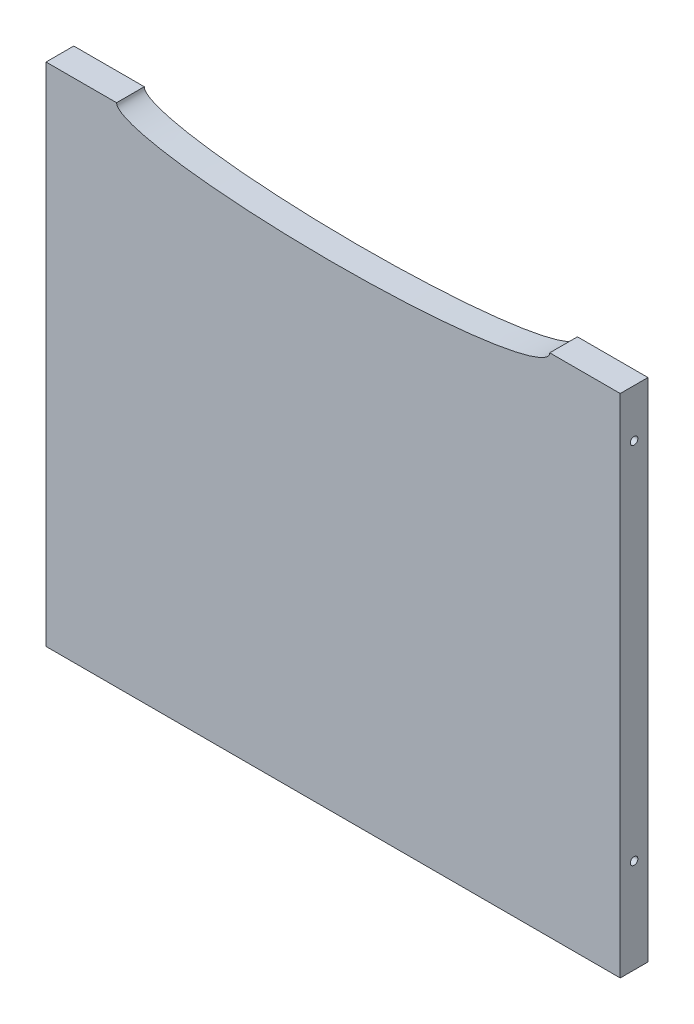
ISO-10303-21;
HEADER;
FILE_DESCRIPTION(('STEP AP214'),'2;1');
FILE_NAME('part.step','',(''),(''),'','','');
FILE_SCHEMA(('AUTOMOTIVE_DESIGN { 1 0 10303 214 1 1 1 1 }'));
ENDSEC;
DATA;
#1=APPLICATION_CONTEXT('core data for automotive mechanical design processes');
#2=APPLICATION_PROTOCOL_DEFINITION('international standard','automotive_design',2000,#1);
#3=PRODUCT_CONTEXT('',#1,'mechanical');
#4=PRODUCT('Part','Part','',(#3));
#5=PRODUCT_RELATED_PRODUCT_CATEGORY('part','',(#4));
#6=PRODUCT_DEFINITION_FORMATION('','',#4);
#7=PRODUCT_DEFINITION_CONTEXT('part definition',#1,'design');
#8=PRODUCT_DEFINITION('design','',#6,#7);
#9=PRODUCT_DEFINITION_SHAPE('','',#8);
#10=(LENGTH_UNIT() NAMED_UNIT(*) SI_UNIT(.MILLI.,.METRE.));
#11=(NAMED_UNIT(*) PLANE_ANGLE_UNIT() SI_UNIT($,.RADIAN.));
#12=(NAMED_UNIT(*) SI_UNIT($,.STERADIAN.) SOLID_ANGLE_UNIT());
#13=UNCERTAINTY_MEASURE_WITH_UNIT(LENGTH_MEASURE(1.E-05),#10,'distance_accuracy_value','');
#14=(GEOMETRIC_REPRESENTATION_CONTEXT(3) GLOBAL_UNCERTAINTY_ASSIGNED_CONTEXT((#13)) GLOBAL_UNIT_ASSIGNED_CONTEXT((#10,
#11,#12)) REPRESENTATION_CONTEXT('',''));
#15=CARTESIAN_POINT('',(0.,0.,0.));
#16=DIRECTION('',(0.,0.,1.));
#17=DIRECTION('',(1.,0.,0.));
#18=AXIS2_PLACEMENT_3D('',#15,#16,#17);
#19=CARTESIAN_POINT('',(0.,159.54375,17.4625));
#20=DIRECTION('',(0.,0.,1.));
#21=DIRECTION('',(1.,0.,0.));
#22=AXIS2_PLACEMENT_3D('',#19,#20,#21);
#23=ELLIPSE('',#22,136.525,19.05);
#24=DIRECTION('',(0.,0.,-1.));
#25=VECTOR('',#24,1.);
#26=SURFACE_OF_LINEAR_EXTRUSION('',#23,#25);
#27=CARTESIAN_POINT('',(0.,159.54375,0.));
#28=DIRECTION('',(0.,0.,1.));
#29=DIRECTION('',(1.,0.,0.));
#30=AXIS2_PLACEMENT_3D('',#27,#28,#29);
#31=ELLIPSE('',#30,136.525,19.05);
#32=CARTESIAN_POINT('',(-136.525,159.54375,0.));
#33=VERTEX_POINT('',#32);
#34=CARTESIAN_POINT('',(136.525,159.54375,0.));
#35=VERTEX_POINT('',#34);
#36=EDGE_CURVE('E122',#33,#35,#31,.T.);
#37=ORIENTED_EDGE('',*,*,#36,.F.);
#38=DIRECTION('',(0.,0.,-1.));
#39=VECTOR('',#38,1.);
#40=CARTESIAN_POINT('',(-136.525,159.54375,17.4625));
#41=LINE('',#40,#39);
#42=CARTESIAN_POINT('',(-136.525,159.54375,17.4625));
#43=VERTEX_POINT('',#42);
#44=EDGE_CURVE('E11',#43,#33,#41,.T.);
#45=ORIENTED_EDGE('',*,*,#44,.F.);
#46=CARTESIAN_POINT('',(136.525,159.54375,17.4625));
#47=VERTEX_POINT('',#46);
#48=EDGE_CURVE('E146',#43,#47,#23,.T.);
#49=ORIENTED_EDGE('',*,*,#48,.T.);
#50=DIRECTION('',(0.,0.,-1.));
#51=VECTOR('',#50,1.);
#52=CARTESIAN_POINT('',(136.525,159.54375,17.4625));
#53=LINE('',#52,#51);
#54=EDGE_CURVE('E60',#47,#35,#53,.T.);
#55=ORIENTED_EDGE('',*,*,#54,.T.);
#56=EDGE_LOOP('',(#37,#45,#49,#55));
#57=FACE_BOUND('',#56,.T.);
#58=ADVANCED_FACE('F37',(#57),#26,.T.);
#59=CARTESIAN_POINT('',(0.,159.54375,17.4625));
#60=DIRECTION('',(0.,1.,0.));
#61=DIRECTION('',(0.,0.,1.));
#62=AXIS2_PLACEMENT_3D('',#59,#60,#61);
#63=PLANE('',#62);
#64=DIRECTION('',(1.,0.,0.));
#65=VECTOR('',#64,1.);
#66=CARTESIAN_POINT('',(0.,159.54375,0.));
#67=LINE('',#66,#65);
#68=CARTESIAN_POINT('',(-180.975,159.54375,0.));
#69=VERTEX_POINT('',#68);
#70=EDGE_CURVE('E124',#69,#33,#67,.T.);
#71=ORIENTED_EDGE('',*,*,#70,.F.);
#72=DIRECTION('',(0.,0.,-1.));
#73=VECTOR('',#72,1.);
#74=CARTESIAN_POINT('',(-180.975,159.54375,17.4625));
#75=LINE('',#74,#73);
#76=CARTESIAN_POINT('',(-180.975,159.54375,17.4625));
#77=VERTEX_POINT('',#76);
#78=EDGE_CURVE('E47',#77,#69,#75,.T.);
#79=ORIENTED_EDGE('',*,*,#78,.F.);
#80=DIRECTION('',(1.,0.,0.));
#81=VECTOR('',#80,1.);
#82=CARTESIAN_POINT('',(0.,159.54375,17.4625));
#83=LINE('',#82,#81);
#84=EDGE_CURVE('E117',#77,#43,#83,.T.);
#85=ORIENTED_EDGE('',*,*,#84,.T.);
#86=ORIENTED_EDGE('',*,*,#44,.T.);
#87=EDGE_LOOP('',(#71,#79,#85,#86));
#88=FACE_BOUND('',#87,.T.);
#89=ADVANCED_FACE('F145',(#88),#63,.T.);
#90=CARTESIAN_POINT('',(-180.975,0.,17.4625));
#91=DIRECTION('',(-1.,0.,0.));
#92=DIRECTION('',(0.,0.,1.));
#93=AXIS2_PLACEMENT_3D('',#90,#91,#92);
#94=PLANE('',#93);
#95=CARTESIAN_POINT('',(-180.975,129.38125,8.73125));
#96=DIRECTION('',(-1.,0.,0.));
#97=DIRECTION('',(0.,0.,1.));
#98=AXIS2_PLACEMENT_3D('',#95,#96,#97);
#99=CIRCLE('',#98,2.38125);
#100=CARTESIAN_POINT('',(-180.975,129.38125,11.1125));
#101=VERTEX_POINT('',#100);
#102=EDGE_CURVE('E168',#101,#101,#99,.T.);
#103=ORIENTED_EDGE('',*,*,#102,.F.);
#104=EDGE_LOOP('',(#103));
#105=FACE_BOUND('',#104,.T.);
#106=CARTESIAN_POINT('',(-180.975,-100.0125,8.73125));
#107=DIRECTION('',(-1.,0.,0.));
#108=DIRECTION('',(0.,0.,1.));
#109=AXIS2_PLACEMENT_3D('',#106,#107,#108);
#110=CIRCLE('',#109,2.38125);
#111=CARTESIAN_POINT('',(-180.975,-100.0125,11.1125));
#112=VERTEX_POINT('',#111);
#113=EDGE_CURVE('E167',#112,#112,#110,.T.);
#114=ORIENTED_EDGE('',*,*,#113,.F.);
#115=EDGE_LOOP('',(#114));
#116=FACE_BOUND('',#115,.T.);
#117=DIRECTION('',(0.,1.,0.));
#118=VECTOR('',#117,1.);
#119=CARTESIAN_POINT('',(-180.975,0.,0.));
#120=LINE('',#119,#118);
#121=CARTESIAN_POINT('',(-180.975,-159.54375,0.));
#122=VERTEX_POINT('',#121);
#123=EDGE_CURVE('E129',#122,#69,#120,.T.);
#124=ORIENTED_EDGE('',*,*,#123,.F.);
#125=DIRECTION('',(0.,0.,-1.));
#126=VECTOR('',#125,1.);
#127=CARTESIAN_POINT('',(-180.975,-159.54375,17.4625));
#128=LINE('',#127,#126);
#129=CARTESIAN_POINT('',(-180.975,-159.54375,17.4625));
#130=VERTEX_POINT('',#129);
#131=EDGE_CURVE('E111',#130,#122,#128,.T.);
#132=ORIENTED_EDGE('',*,*,#131,.F.);
#133=DIRECTION('',(0.,1.,0.));
#134=VECTOR('',#133,1.);
#135=CARTESIAN_POINT('',(-180.975,0.,17.4625));
#136=LINE('',#135,#134);
#137=EDGE_CURVE('E102',#130,#77,#136,.T.);
#138=ORIENTED_EDGE('',*,*,#137,.T.);
#139=ORIENTED_EDGE('',*,*,#78,.T.);
#140=EDGE_LOOP('',(#124,#132,#138,#139));
#141=FACE_BOUND('',#140,.T.);
#142=ADVANCED_FACE('F143',(#105,#116,#141),#94,.T.);
#143=CARTESIAN_POINT('',(0.,-159.54375,17.4625));
#144=DIRECTION('',(0.,1.,0.));
#145=DIRECTION('',(0.,0.,1.));
#146=AXIS2_PLACEMENT_3D('',#143,#144,#145);
#147=PLANE('',#146);
#148=CARTESIAN_POINT('',(-111.125,-159.54375,8.73125));
#149=DIRECTION('',(0.,-1.,0.));
#150=DIRECTION('',(0.,0.,-1.));
#151=AXIS2_PLACEMENT_3D('',#148,#149,#150);
#152=CIRCLE('',#151,2.38125000000001);
#153=CARTESIAN_POINT('',(-111.125,-159.54375,6.34999999999999));
#154=VERTEX_POINT('',#153);
#155=EDGE_CURVE('E182',#154,#154,#152,.T.);
#156=ORIENTED_EDGE('',*,*,#155,.F.);
#157=EDGE_LOOP('',(#156));
#158=FACE_BOUND('',#157,.T.);
#159=CARTESIAN_POINT('',(111.125,-159.54375,8.73125));
#160=DIRECTION('',(0.,-1.,0.));
#161=DIRECTION('',(0.,0.,-1.));
#162=AXIS2_PLACEMENT_3D('',#159,#160,#161);
#163=CIRCLE('',#162,2.38125000000001);
#164=CARTESIAN_POINT('',(111.125,-159.54375,6.34999999999999));
#165=VERTEX_POINT('',#164);
#166=EDGE_CURVE('E177',#165,#165,#163,.T.);
#167=ORIENTED_EDGE('',*,*,#166,.F.);
#168=EDGE_LOOP('',(#167));
#169=FACE_BOUND('',#168,.T.);
#170=DIRECTION('',(1.,0.,0.));
#171=VECTOR('',#170,1.);
#172=CARTESIAN_POINT('',(0.,-159.54375,0.));
#173=LINE('',#172,#171);
#174=CARTESIAN_POINT('',(180.975,-159.54375,0.));
#175=VERTEX_POINT('',#174);
#176=EDGE_CURVE('E112',#122,#175,#173,.T.);
#177=ORIENTED_EDGE('',*,*,#176,.T.);
#178=DIRECTION('',(0.,0.,-1.));
#179=VECTOR('',#178,1.);
#180=CARTESIAN_POINT('',(180.975,-159.54375,17.4625));
#181=LINE('',#180,#179);
#182=CARTESIAN_POINT('',(180.975,-159.54375,17.4625));
#183=VERTEX_POINT('',#182);
#184=EDGE_CURVE('E107',#183,#175,#181,.T.);
#185=ORIENTED_EDGE('',*,*,#184,.F.);
#186=DIRECTION('',(1.,0.,0.));
#187=VECTOR('',#186,1.);
#188=CARTESIAN_POINT('',(0.,-159.54375,17.4625));
#189=LINE('',#188,#187);
#190=EDGE_CURVE('E96',#130,#183,#189,.T.);
#191=ORIENTED_EDGE('',*,*,#190,.F.);
#192=ORIENTED_EDGE('',*,*,#131,.T.);
#193=EDGE_LOOP('',(#177,#185,#191,#192));
#194=FACE_BOUND('',#193,.T.);
#195=ADVANCED_FACE('F108',(#158,#169,#194),#147,.F.);
#196=CARTESIAN_POINT('',(180.975,0.,17.4625));
#197=DIRECTION('',(-1.,0.,0.));
#198=DIRECTION('',(0.,0.,1.));
#199=AXIS2_PLACEMENT_3D('',#196,#197,#198);
#200=PLANE('',#199);
#201=CARTESIAN_POINT('',(180.975,129.38125,8.73125));
#202=DIRECTION('',(1.,0.,0.));
#203=DIRECTION('',(0.,0.,-1.));
#204=AXIS2_PLACEMENT_3D('',#201,#202,#203);
#205=CIRCLE('',#204,2.38125);
#206=CARTESIAN_POINT('',(180.975,129.38125,6.35));
#207=VERTEX_POINT('',#206);
#208=EDGE_CURVE('E158',#207,#207,#205,.T.);
#209=ORIENTED_EDGE('',*,*,#208,.F.);
#210=EDGE_LOOP('',(#209));
#211=FACE_BOUND('',#210,.T.);
#212=CARTESIAN_POINT('',(180.975,-100.0125,8.73125));
#213=DIRECTION('',(1.,0.,0.));
#214=DIRECTION('',(0.,0.,-1.));
#215=AXIS2_PLACEMENT_3D('',#212,#213,#214);
#216=CIRCLE('',#215,2.38125);
#217=CARTESIAN_POINT('',(180.975,-100.0125,6.35));
#218=VERTEX_POINT('',#217);
#219=EDGE_CURVE('E152',#218,#218,#216,.T.);
#220=ORIENTED_EDGE('',*,*,#219,.F.);
#221=EDGE_LOOP('',(#220));
#222=FACE_BOUND('',#221,.T.);
#223=DIRECTION('',(0.,1.,0.));
#224=VECTOR('',#223,1.);
#225=CARTESIAN_POINT('',(180.975,0.,0.));
#226=LINE('',#225,#224);
#227=CARTESIAN_POINT('',(180.975,159.54375,0.));
#228=VERTEX_POINT('',#227);
#229=EDGE_CURVE('E133',#175,#228,#226,.T.);
#230=ORIENTED_EDGE('',*,*,#229,.T.);
#231=DIRECTION('',(0.,0.,-1.));
#232=VECTOR('',#231,1.);
#233=CARTESIAN_POINT('',(180.975,159.54375,17.4625));
#234=LINE('',#233,#232);
#235=CARTESIAN_POINT('',(180.975,159.54375,17.4625));
#236=VERTEX_POINT('',#235);
#237=EDGE_CURVE('E76',#236,#228,#234,.T.);
#238=ORIENTED_EDGE('',*,*,#237,.F.);
#239=DIRECTION('',(0.,1.,0.));
#240=VECTOR('',#239,1.);
#241=CARTESIAN_POINT('',(180.975,0.,17.4625));
#242=LINE('',#241,#240);
#243=EDGE_CURVE('E101',#183,#236,#242,.T.);
#244=ORIENTED_EDGE('',*,*,#243,.F.);
#245=ORIENTED_EDGE('',*,*,#184,.T.);
#246=EDGE_LOOP('',(#230,#238,#244,#245));
#247=FACE_BOUND('',#246,.T.);
#248=ADVANCED_FACE('F119',(#211,#222,#247),#200,.F.);
#249=EDGE_CURVE('E128',#35,#228,#67,.T.);
#250=ORIENTED_EDGE('',*,*,#249,.F.);
#251=ORIENTED_EDGE('',*,*,#54,.F.);
#252=EDGE_CURVE('E116',#47,#236,#83,.T.);
#253=ORIENTED_EDGE('',*,*,#252,.T.);
#254=ORIENTED_EDGE('',*,*,#237,.T.);
#255=EDGE_LOOP('',(#250,#251,#253,#254));
#256=FACE_BOUND('',#255,.T.);
#257=ADVANCED_FACE('F222',(#256),#63,.T.);
#258=CARTESIAN_POINT('',(0.,0.,17.4625));
#259=DIRECTION('',(0.,0.,1.));
#260=DIRECTION('',(1.,0.,0.));
#261=AXIS2_PLACEMENT_3D('',#258,#259,#260);
#262=PLANE('',#261);
#263=ORIENTED_EDGE('',*,*,#48,.F.);
#264=ORIENTED_EDGE('',*,*,#84,.F.);
#265=ORIENTED_EDGE('',*,*,#137,.F.);
#266=ORIENTED_EDGE('',*,*,#190,.T.);
#267=ORIENTED_EDGE('',*,*,#243,.T.);
#268=ORIENTED_EDGE('',*,*,#252,.F.);
#269=EDGE_LOOP('',(#263,#264,#265,#266,#267,#268));
#270=FACE_BOUND('',#269,.T.);
#271=ADVANCED_FACE('F98',(#270),#262,.T.);
#272=CARTESIAN_POINT('',(0.,0.,0.));
#273=DIRECTION('',(0.,0.,1.));
#274=DIRECTION('',(1.,0.,0.));
#275=AXIS2_PLACEMENT_3D('',#272,#273,#274);
#276=PLANE('',#275);
#277=ORIENTED_EDGE('',*,*,#36,.T.);
#278=ORIENTED_EDGE('',*,*,#249,.T.);
#279=ORIENTED_EDGE('',*,*,#229,.F.);
#280=ORIENTED_EDGE('',*,*,#176,.F.);
#281=ORIENTED_EDGE('',*,*,#123,.T.);
#282=ORIENTED_EDGE('',*,*,#70,.T.);
#283=EDGE_LOOP('',(#277,#278,#279,#280,#281,#282));
#284=FACE_BOUND('',#283,.T.);
#285=ADVANCED_FACE('F148',(#284),#276,.F.);
#286=CARTESIAN_POINT('',(130.175,-100.0125,8.73125));
#287=DIRECTION('',(1.,0.,0.));
#288=DIRECTION('',(0.,0.,-1.));
#289=AXIS2_PLACEMENT_3D('',#286,#287,#288);
#290=CYLINDRICAL_SURFACE('',#289,2.38125);
#291=CARTESIAN_POINT('',(130.175,-100.0125,8.73125));
#292=DIRECTION('',(1.,0.,0.));
#293=DIRECTION('',(0.,0.,-1.));
#294=AXIS2_PLACEMENT_3D('',#291,#292,#293);
#295=CIRCLE('',#294,2.38125);
#296=CARTESIAN_POINT('',(130.175,-100.0125,6.35));
#297=VERTEX_POINT('',#296);
#298=EDGE_CURVE('E151',#297,#297,#295,.T.);
#299=ORIENTED_EDGE('',*,*,#298,.F.);
#300=EDGE_LOOP('',(#299));
#301=FACE_BOUND('',#300,.T.);
#302=ORIENTED_EDGE('',*,*,#219,.T.);
#303=EDGE_LOOP('',(#302));
#304=FACE_BOUND('',#303,.T.);
#305=ADVANCED_FACE('F245',(#301,#304),#290,.F.);
#306=CARTESIAN_POINT('',(130.175,-100.0125,8.73125));
#307=DIRECTION('',(1.,0.,0.));
#308=DIRECTION('',(0.,0.,-1.));
#309=AXIS2_PLACEMENT_3D('',#306,#307,#308);
#310=PLANE('',#309);
#311=ORIENTED_EDGE('',*,*,#298,.T.);
#312=EDGE_LOOP('',(#311));
#313=FACE_BOUND('',#312,.T.);
#314=ADVANCED_FACE('F243',(#313),#310,.T.);
#315=CARTESIAN_POINT('',(130.175,129.38125,8.73125));
#316=DIRECTION('',(1.,0.,0.));
#317=DIRECTION('',(0.,0.,-1.));
#318=AXIS2_PLACEMENT_3D('',#315,#316,#317);
#319=CYLINDRICAL_SURFACE('',#318,2.38125);
#320=CARTESIAN_POINT('',(130.175,129.38125,8.73125));
#321=DIRECTION('',(1.,0.,0.));
#322=DIRECTION('',(0.,0.,-1.));
#323=AXIS2_PLACEMENT_3D('',#320,#321,#322);
#324=CIRCLE('',#323,2.38125);
#325=CARTESIAN_POINT('',(130.175,129.38125,6.35));
#326=VERTEX_POINT('',#325);
#327=EDGE_CURVE('E127',#326,#326,#324,.T.);
#328=ORIENTED_EDGE('',*,*,#327,.F.);
#329=EDGE_LOOP('',(#328));
#330=FACE_BOUND('',#329,.T.);
#331=ORIENTED_EDGE('',*,*,#208,.T.);
#332=EDGE_LOOP('',(#331));
#333=FACE_BOUND('',#332,.T.);
#334=ADVANCED_FACE('F247',(#330,#333),#319,.F.);
#335=CARTESIAN_POINT('',(130.175,129.38125,8.73125));
#336=DIRECTION('',(1.,0.,0.));
#337=DIRECTION('',(0.,0.,-1.));
#338=AXIS2_PLACEMENT_3D('',#335,#336,#337);
#339=PLANE('',#338);
#340=ORIENTED_EDGE('',*,*,#327,.T.);
#341=EDGE_LOOP('',(#340));
#342=FACE_BOUND('',#341,.T.);
#343=ADVANCED_FACE('F260',(#342),#339,.T.);
#344=CARTESIAN_POINT('',(-130.175,-100.0125,8.73125));
#345=DIRECTION('',(-1.,0.,0.));
#346=DIRECTION('',(0.,0.,1.));
#347=AXIS2_PLACEMENT_3D('',#344,#345,#346);
#348=CYLINDRICAL_SURFACE('',#347,2.38125);
#349=CARTESIAN_POINT('',(-130.175,-100.0125,8.73125));
#350=DIRECTION('',(-1.,0.,0.));
#351=DIRECTION('',(0.,0.,1.));
#352=AXIS2_PLACEMENT_3D('',#349,#350,#351);
#353=CIRCLE('',#352,2.38125);
#354=CARTESIAN_POINT('',(-130.175,-100.0125,11.1125));
#355=VERTEX_POINT('',#354);
#356=EDGE_CURVE('E162',#355,#355,#353,.T.);
#357=ORIENTED_EDGE('',*,*,#356,.F.);
#358=EDGE_LOOP('',(#357));
#359=FACE_BOUND('',#358,.T.);
#360=ORIENTED_EDGE('',*,*,#113,.T.);
#361=EDGE_LOOP('',(#360));
#362=FACE_BOUND('',#361,.T.);
#363=ADVANCED_FACE('F261',(#359,#362),#348,.F.);
#364=CARTESIAN_POINT('',(-130.175,-100.0125,8.73125));
#365=DIRECTION('',(-1.,0.,0.));
#366=DIRECTION('',(0.,0.,1.));
#367=AXIS2_PLACEMENT_3D('',#364,#365,#366);
#368=PLANE('',#367);
#369=ORIENTED_EDGE('',*,*,#356,.T.);
#370=EDGE_LOOP('',(#369));
#371=FACE_BOUND('',#370,.T.);
#372=ADVANCED_FACE('F263',(#371),#368,.T.);
#373=CARTESIAN_POINT('',(-130.175,129.38125,8.73125));
#374=DIRECTION('',(-1.,0.,0.));
#375=DIRECTION('',(0.,0.,1.));
#376=AXIS2_PLACEMENT_3D('',#373,#374,#375);
#377=CYLINDRICAL_SURFACE('',#376,2.38125);
#378=CARTESIAN_POINT('',(-130.175,129.38125,8.73125));
#379=DIRECTION('',(-1.,0.,0.));
#380=DIRECTION('',(0.,0.,1.));
#381=AXIS2_PLACEMENT_3D('',#378,#379,#380);
#382=CIRCLE('',#381,2.38125);
#383=CARTESIAN_POINT('',(-130.175,129.38125,11.1125));
#384=VERTEX_POINT('',#383);
#385=EDGE_CURVE('E154',#384,#384,#382,.T.);
#386=ORIENTED_EDGE('',*,*,#385,.F.);
#387=EDGE_LOOP('',(#386));
#388=FACE_BOUND('',#387,.T.);
#389=ORIENTED_EDGE('',*,*,#102,.T.);
#390=EDGE_LOOP('',(#389));
#391=FACE_BOUND('',#390,.T.);
#392=ADVANCED_FACE('F215',(#388,#391),#377,.F.);
#393=CARTESIAN_POINT('',(-130.175,129.38125,8.73125));
#394=DIRECTION('',(-1.,0.,0.));
#395=DIRECTION('',(0.,0.,1.));
#396=AXIS2_PLACEMENT_3D('',#393,#394,#395);
#397=PLANE('',#396);
#398=ORIENTED_EDGE('',*,*,#385,.T.);
#399=EDGE_LOOP('',(#398));
#400=FACE_BOUND('',#399,.T.);
#401=ADVANCED_FACE('F201',(#400),#397,.T.);
#402=CARTESIAN_POINT('',(111.125,-108.74375,8.73125));
#403=DIRECTION('',(0.,-1.,0.));
#404=DIRECTION('',(0.,0.,-1.));
#405=AXIS2_PLACEMENT_3D('',#402,#403,#404);
#406=CYLINDRICAL_SURFACE('',#405,2.38125000000001);
#407=CARTESIAN_POINT('',(111.125,-108.74375,8.73125));
#408=DIRECTION('',(0.,-1.,0.));
#409=DIRECTION('',(0.,0.,-1.));
#410=AXIS2_PLACEMENT_3D('',#407,#408,#409);
#411=CIRCLE('',#410,2.38125000000001);
#412=CARTESIAN_POINT('',(111.125,-108.74375,6.34999999999999));
#413=VERTEX_POINT('',#412);
#414=EDGE_CURVE('E172',#413,#413,#411,.T.);
#415=ORIENTED_EDGE('',*,*,#414,.F.);
#416=EDGE_LOOP('',(#415));
#417=FACE_BOUND('',#416,.T.);
#418=ORIENTED_EDGE('',*,*,#166,.T.);
#419=EDGE_LOOP('',(#418));
#420=FACE_BOUND('',#419,.T.);
#421=ADVANCED_FACE('F203',(#417,#420),#406,.F.);
#422=CARTESIAN_POINT('',(111.125,-108.74375,8.73125));
#423=DIRECTION('',(0.,-1.,0.));
#424=DIRECTION('',(0.,0.,-1.));
#425=AXIS2_PLACEMENT_3D('',#422,#423,#424);
#426=PLANE('',#425);
#427=ORIENTED_EDGE('',*,*,#414,.T.);
#428=EDGE_LOOP('',(#427));
#429=FACE_BOUND('',#428,.T.);
#430=ADVANCED_FACE('F191',(#429),#426,.T.);
#431=CARTESIAN_POINT('',(-111.125,-108.74375,8.73125));
#432=DIRECTION('',(0.,-1.,0.));
#433=DIRECTION('',(0.,0.,-1.));
#434=AXIS2_PLACEMENT_3D('',#431,#432,#433);
#435=CYLINDRICAL_SURFACE('',#434,2.38125000000001);
#436=CARTESIAN_POINT('',(-111.125,-108.74375,8.73125));
#437=DIRECTION('',(0.,-1.,0.));
#438=DIRECTION('',(0.,0.,-1.));
#439=AXIS2_PLACEMENT_3D('',#436,#437,#438);
#440=CIRCLE('',#439,2.38125000000001);
#441=CARTESIAN_POINT('',(-111.125,-108.74375,6.34999999999999));
#442=VERTEX_POINT('',#441);
#443=EDGE_CURVE('E170',#442,#442,#440,.T.);
#444=ORIENTED_EDGE('',*,*,#443,.F.);
#445=EDGE_LOOP('',(#444));
#446=FACE_BOUND('',#445,.T.);
#447=ORIENTED_EDGE('',*,*,#155,.T.);
#448=EDGE_LOOP('',(#447));
#449=FACE_BOUND('',#448,.T.);
#450=ADVANCED_FACE('F188',(#446,#449),#435,.F.);
#451=CARTESIAN_POINT('',(-111.125,-108.74375,8.73125));
#452=DIRECTION('',(0.,-1.,0.));
#453=DIRECTION('',(0.,0.,-1.));
#454=AXIS2_PLACEMENT_3D('',#451,#452,#453);
#455=PLANE('',#454);
#456=ORIENTED_EDGE('',*,*,#443,.T.);
#457=EDGE_LOOP('',(#456));
#458=FACE_BOUND('',#457,.T.);
#459=ADVANCED_FACE('F186',(#458),#455,.T.);
#460=CLOSED_SHELL('',(#58,#89,#142,#195,#248,#257,#271,#285,#305,#314,#334,#343,#363,#372,#392,
#401,#421,#430,#450,#459));
#461=MANIFOLD_SOLID_BREP('B2',#460);
#462=ADVANCED_BREP_SHAPE_REPRESENTATION('',(#18,#461),#14);
#463=SHAPE_DEFINITION_REPRESENTATION(#9,#462);
ENDSEC;
END-ISO-10303-21;
